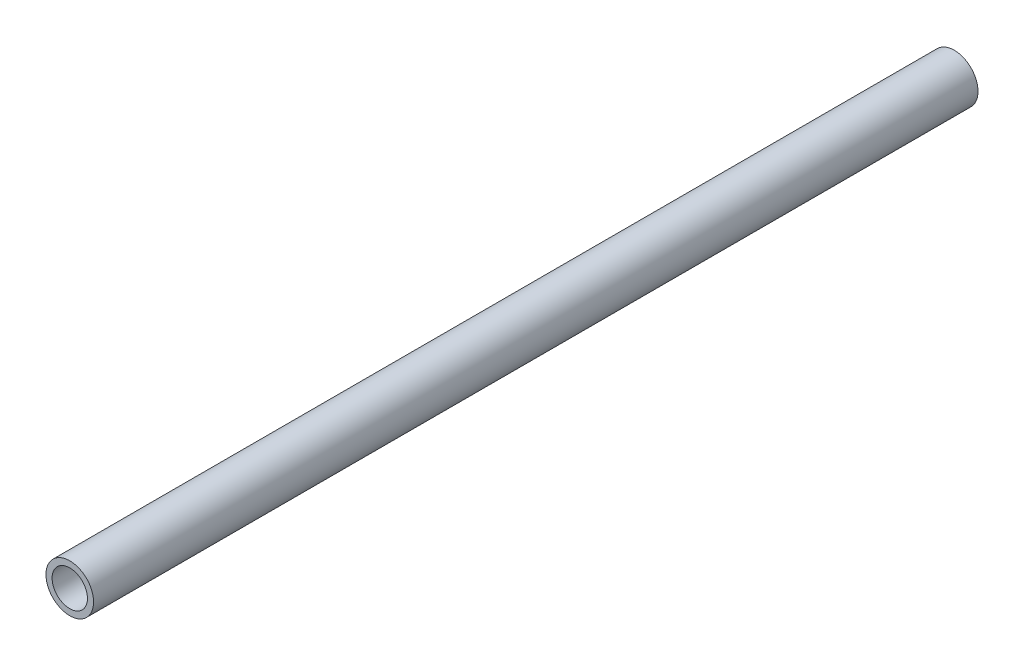
ISO-10303-21;
HEADER;
FILE_DESCRIPTION(('STEP AP214'),'2;1');
FILE_NAME('part.step','',(''),(''),'','','');
FILE_SCHEMA(('AUTOMOTIVE_DESIGN { 1 0 10303 214 1 1 1 1 }'));
ENDSEC;
DATA;
#1=APPLICATION_CONTEXT('core data for automotive mechanical design processes');
#2=APPLICATION_PROTOCOL_DEFINITION('international standard','automotive_design',2000,#1);
#3=PRODUCT_CONTEXT('',#1,'mechanical');
#4=PRODUCT('Part','Part','',(#3));
#5=PRODUCT_RELATED_PRODUCT_CATEGORY('part','',(#4));
#6=PRODUCT_DEFINITION_FORMATION('','',#4);
#7=PRODUCT_DEFINITION_CONTEXT('part definition',#1,'design');
#8=PRODUCT_DEFINITION('design','',#6,#7);
#9=PRODUCT_DEFINITION_SHAPE('','',#8);
#10=(LENGTH_UNIT() NAMED_UNIT(*) SI_UNIT(.MILLI.,.METRE.));
#11=(NAMED_UNIT(*) PLANE_ANGLE_UNIT() SI_UNIT($,.RADIAN.));
#12=(NAMED_UNIT(*) SI_UNIT($,.STERADIAN.) SOLID_ANGLE_UNIT());
#13=UNCERTAINTY_MEASURE_WITH_UNIT(LENGTH_MEASURE(1.E-05),#10,'distance_accuracy_value','');
#14=(GEOMETRIC_REPRESENTATION_CONTEXT(3) GLOBAL_UNCERTAINTY_ASSIGNED_CONTEXT((#13)) GLOBAL_UNIT_ASSIGNED_CONTEXT((#10,
#11,#12)) REPRESENTATION_CONTEXT('',''));
#15=CARTESIAN_POINT('',(0.,0.,0.));
#16=DIRECTION('',(0.,0.,1.));
#17=DIRECTION('',(1.,0.,0.));
#18=AXIS2_PLACEMENT_3D('',#15,#16,#17);
#19=CARTESIAN_POINT('',(0.,0.,130.));
#20=DIRECTION('',(0.,0.,1.));
#21=DIRECTION('',(1.,0.,0.));
#22=AXIS2_PLACEMENT_3D('',#19,#20,#21);
#23=PLANE('',#22);
#24=CARTESIAN_POINT('',(0.,0.,130.));
#25=DIRECTION('',(0.,0.,1.));
#26=DIRECTION('',(1.,0.,0.));
#27=AXIS2_PLACEMENT_3D('',#24,#25,#26);
#28=CIRCLE('',#27,3.5);
#29=CARTESIAN_POINT('',(3.5,0.,130.));
#30=VERTEX_POINT('',#29);
#31=EDGE_CURVE('E10',#30,#30,#28,.T.);
#32=ORIENTED_EDGE('',*,*,#31,.T.);
#33=EDGE_LOOP('',(#32));
#34=FACE_BOUND('',#33,.T.);
#35=CARTESIAN_POINT('',(0.,0.,130.));
#36=DIRECTION('',(0.,0.,1.));
#37=DIRECTION('',(1.,0.,0.));
#38=AXIS2_PLACEMENT_3D('',#35,#36,#37);
#39=CIRCLE('',#38,2.6);
#40=CARTESIAN_POINT('',(2.6,0.,130.));
#41=VERTEX_POINT('',#40);
#42=EDGE_CURVE('E47',#41,#41,#39,.T.);
#43=ORIENTED_EDGE('',*,*,#42,.F.);
#44=EDGE_LOOP('',(#43));
#45=FACE_BOUND('',#44,.T.);
#46=ADVANCED_FACE('F35',(#34,#45),#23,.T.);
#47=CARTESIAN_POINT('',(0.,0.,0.));
#48=DIRECTION('',(0.,0.,1.));
#49=DIRECTION('',(1.,0.,0.));
#50=AXIS2_PLACEMENT_3D('',#47,#48,#49);
#51=PLANE('',#50);
#52=CARTESIAN_POINT('',(0.,0.,0.));
#53=DIRECTION('',(0.,0.,1.));
#54=DIRECTION('',(1.,0.,0.));
#55=AXIS2_PLACEMENT_3D('',#52,#53,#54);
#56=CIRCLE('',#55,3.5);
#57=CARTESIAN_POINT('',(3.5,0.,0.));
#58=VERTEX_POINT('',#57);
#59=EDGE_CURVE('E39',#58,#58,#56,.T.);
#60=ORIENTED_EDGE('',*,*,#59,.F.);
#61=EDGE_LOOP('',(#60));
#62=FACE_BOUND('',#61,.T.);
#63=CARTESIAN_POINT('',(0.,0.,0.));
#64=DIRECTION('',(0.,0.,1.));
#65=DIRECTION('',(1.,0.,0.));
#66=AXIS2_PLACEMENT_3D('',#63,#64,#65);
#67=CIRCLE('',#66,2.6);
#68=CARTESIAN_POINT('',(2.6,0.,0.));
#69=VERTEX_POINT('',#68);
#70=EDGE_CURVE('E49',#69,#69,#67,.T.);
#71=ORIENTED_EDGE('',*,*,#70,.T.);
#72=EDGE_LOOP('',(#71));
#73=FACE_BOUND('',#72,.T.);
#74=ADVANCED_FACE('F60',(#62,#73),#51,.F.);
#75=CARTESIAN_POINT('',(0.,0.,130.));
#76=DIRECTION('',(0.,0.,-1.));
#77=DIRECTION('',(-1.,0.,0.));
#78=AXIS2_PLACEMENT_3D('',#75,#76,#77);
#79=CYLINDRICAL_SURFACE('',#78,3.5);
#80=ORIENTED_EDGE('',*,*,#31,.F.);
#81=EDGE_LOOP('',(#80));
#82=FACE_BOUND('',#81,.T.);
#83=ORIENTED_EDGE('',*,*,#59,.T.);
#84=EDGE_LOOP('',(#83));
#85=FACE_BOUND('',#84,.T.);
#86=ADVANCED_FACE('F37',(#82,#85),#79,.T.);
#87=CARTESIAN_POINT('',(0.,0.,130.));
#88=DIRECTION('',(0.,0.,-1.));
#89=DIRECTION('',(-1.,0.,0.));
#90=AXIS2_PLACEMENT_3D('',#87,#88,#89);
#91=CYLINDRICAL_SURFACE('',#90,2.6);
#92=ORIENTED_EDGE('',*,*,#42,.T.);
#93=EDGE_LOOP('',(#92));
#94=FACE_BOUND('',#93,.T.);
#95=ORIENTED_EDGE('',*,*,#70,.F.);
#96=EDGE_LOOP('',(#95));
#97=FACE_BOUND('',#96,.T.);
#98=ADVANCED_FACE('F56',(#94,#97),#91,.F.);
#99=CLOSED_SHELL('',(#46,#74,#86,#98));
#100=MANIFOLD_SOLID_BREP('B2',#99);
#101=ADVANCED_BREP_SHAPE_REPRESENTATION('',(#18,#100),#14);
#102=SHAPE_DEFINITION_REPRESENTATION(#9,#101);
ENDSEC;
END-ISO-10303-21;
